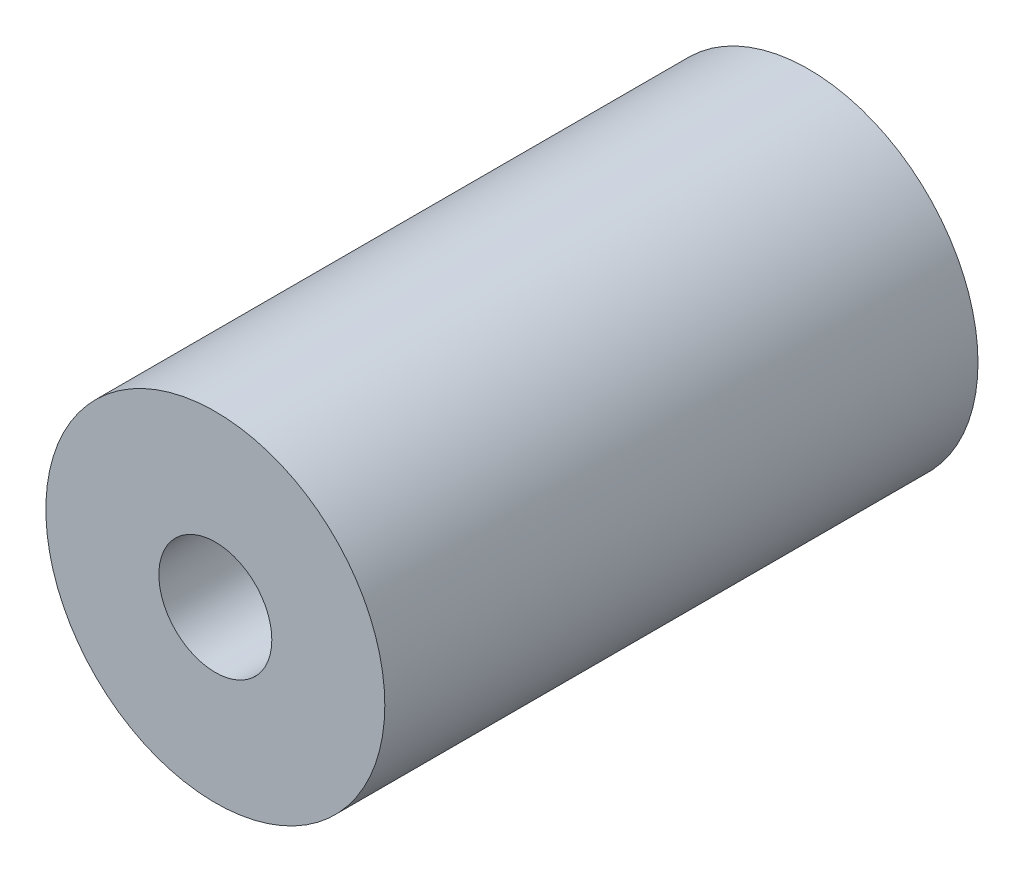
ISO-10303-21;
HEADER;
FILE_DESCRIPTION(('STEP AP214'),'2;1');
FILE_NAME('part.step','',(''),(''),'','','');
FILE_SCHEMA(('AUTOMOTIVE_DESIGN { 1 0 10303 214 1 1 1 1 }'));
ENDSEC;
DATA;
#1=APPLICATION_CONTEXT('core data for automotive mechanical design processes');
#2=APPLICATION_PROTOCOL_DEFINITION('international standard','automotive_design',2000,#1);
#3=PRODUCT_CONTEXT('',#1,'mechanical');
#4=PRODUCT('Part','Part','',(#3));
#5=PRODUCT_RELATED_PRODUCT_CATEGORY('part','',(#4));
#6=PRODUCT_DEFINITION_FORMATION('','',#4);
#7=PRODUCT_DEFINITION_CONTEXT('part definition',#1,'design');
#8=PRODUCT_DEFINITION('design','',#6,#7);
#9=PRODUCT_DEFINITION_SHAPE('','',#8);
#10=(LENGTH_UNIT() NAMED_UNIT(*) SI_UNIT(.MILLI.,.METRE.));
#11=(NAMED_UNIT(*) PLANE_ANGLE_UNIT() SI_UNIT($,.RADIAN.));
#12=(NAMED_UNIT(*) SI_UNIT($,.STERADIAN.) SOLID_ANGLE_UNIT());
#13=UNCERTAINTY_MEASURE_WITH_UNIT(LENGTH_MEASURE(1.E-05),#10,'distance_accuracy_value','');
#14=(GEOMETRIC_REPRESENTATION_CONTEXT(3) GLOBAL_UNCERTAINTY_ASSIGNED_CONTEXT((#13)) GLOBAL_UNIT_ASSIGNED_CONTEXT((#10,
#11,#12)) REPRESENTATION_CONTEXT('',''));
#15=CARTESIAN_POINT('',(0.,0.,0.));
#16=DIRECTION('',(0.,0.,1.));
#17=DIRECTION('',(1.,0.,0.));
#18=AXIS2_PLACEMENT_3D('',#15,#16,#17);
#19=CARTESIAN_POINT('',(0.,0.,105.));
#20=DIRECTION('',(0.,0.,1.));
#21=DIRECTION('',(1.,0.,0.));
#22=AXIS2_PLACEMENT_3D('',#19,#20,#21);
#23=PLANE('',#22);
#24=CARTESIAN_POINT('',(0.,0.,105.));
#25=DIRECTION('',(0.,0.,1.));
#26=DIRECTION('',(1.,0.,0.));
#27=AXIS2_PLACEMENT_3D('',#24,#25,#26);
#28=CIRCLE('',#27,30.);
#29=CARTESIAN_POINT('',(30.,0.,105.));
#30=VERTEX_POINT('',#29);
#31=EDGE_CURVE('E10',#30,#30,#28,.T.);
#32=ORIENTED_EDGE('',*,*,#31,.T.);
#33=EDGE_LOOP('',(#32));
#34=FACE_BOUND('',#33,.T.);
#35=CARTESIAN_POINT('',(0.,0.,105.));
#36=DIRECTION('',(0.,0.,1.));
#37=DIRECTION('',(1.,0.,0.));
#38=AXIS2_PLACEMENT_3D('',#35,#36,#37);
#39=CIRCLE('',#38,10.);
#40=CARTESIAN_POINT('',(10.,0.,105.));
#41=VERTEX_POINT('',#40);
#42=EDGE_CURVE('E45',#41,#41,#39,.T.);
#43=ORIENTED_EDGE('',*,*,#42,.F.);
#44=EDGE_LOOP('',(#43));
#45=FACE_BOUND('',#44,.T.);
#46=ADVANCED_FACE('F34',(#34,#45),#23,.T.);
#47=CARTESIAN_POINT('',(0.,0.,0.));
#48=DIRECTION('',(0.,0.,1.));
#49=DIRECTION('',(1.,0.,0.));
#50=AXIS2_PLACEMENT_3D('',#47,#48,#49);
#51=PLANE('',#50);
#52=CARTESIAN_POINT('',(0.,0.,0.));
#53=DIRECTION('',(0.,0.,1.));
#54=DIRECTION('',(1.,0.,0.));
#55=AXIS2_PLACEMENT_3D('',#52,#53,#54);
#56=CIRCLE('',#55,30.);
#57=CARTESIAN_POINT('',(30.,0.,0.));
#58=VERTEX_POINT('',#57);
#59=EDGE_CURVE('E38',#58,#58,#56,.T.);
#60=ORIENTED_EDGE('',*,*,#59,.F.);
#61=EDGE_LOOP('',(#60));
#62=FACE_BOUND('',#61,.T.);
#63=CARTESIAN_POINT('',(0.,0.,0.));
#64=DIRECTION('',(0.,0.,1.));
#65=DIRECTION('',(1.,0.,0.));
#66=AXIS2_PLACEMENT_3D('',#63,#64,#65);
#67=CIRCLE('',#66,10.);
#68=CARTESIAN_POINT('',(10.,0.,0.));
#69=VERTEX_POINT('',#68);
#70=EDGE_CURVE('E47',#69,#69,#67,.T.);
#71=ORIENTED_EDGE('',*,*,#70,.T.);
#72=EDGE_LOOP('',(#71));
#73=FACE_BOUND('',#72,.T.);
#74=ADVANCED_FACE('F57',(#62,#73),#51,.F.);
#75=CARTESIAN_POINT('',(0.,0.,105.));
#76=DIRECTION('',(0.,0.,-1.));
#77=DIRECTION('',(-1.,0.,0.));
#78=AXIS2_PLACEMENT_3D('',#75,#76,#77);
#79=CYLINDRICAL_SURFACE('',#78,30.);
#80=ORIENTED_EDGE('',*,*,#31,.F.);
#81=EDGE_LOOP('',(#80));
#82=FACE_BOUND('',#81,.T.);
#83=ORIENTED_EDGE('',*,*,#59,.T.);
#84=EDGE_LOOP('',(#83));
#85=FACE_BOUND('',#84,.T.);
#86=ADVANCED_FACE('F36',(#82,#85),#79,.T.);
#87=CARTESIAN_POINT('',(0.,0.,105.));
#88=DIRECTION('',(0.,0.,-1.));
#89=DIRECTION('',(-1.,0.,0.));
#90=AXIS2_PLACEMENT_3D('',#87,#88,#89);
#91=CYLINDRICAL_SURFACE('',#90,10.);
#92=ORIENTED_EDGE('',*,*,#42,.T.);
#93=EDGE_LOOP('',(#92));
#94=FACE_BOUND('',#93,.T.);
#95=ORIENTED_EDGE('',*,*,#70,.F.);
#96=EDGE_LOOP('',(#95));
#97=FACE_BOUND('',#96,.T.);
#98=ADVANCED_FACE('F53',(#94,#97),#91,.F.);
#99=CLOSED_SHELL('',(#46,#74,#86,#98));
#100=MANIFOLD_SOLID_BREP('B2',#99);
#101=ADVANCED_BREP_SHAPE_REPRESENTATION('',(#18,#100),#14);
#102=SHAPE_DEFINITION_REPRESENTATION(#9,#101);
ENDSEC;
END-ISO-10303-21;
